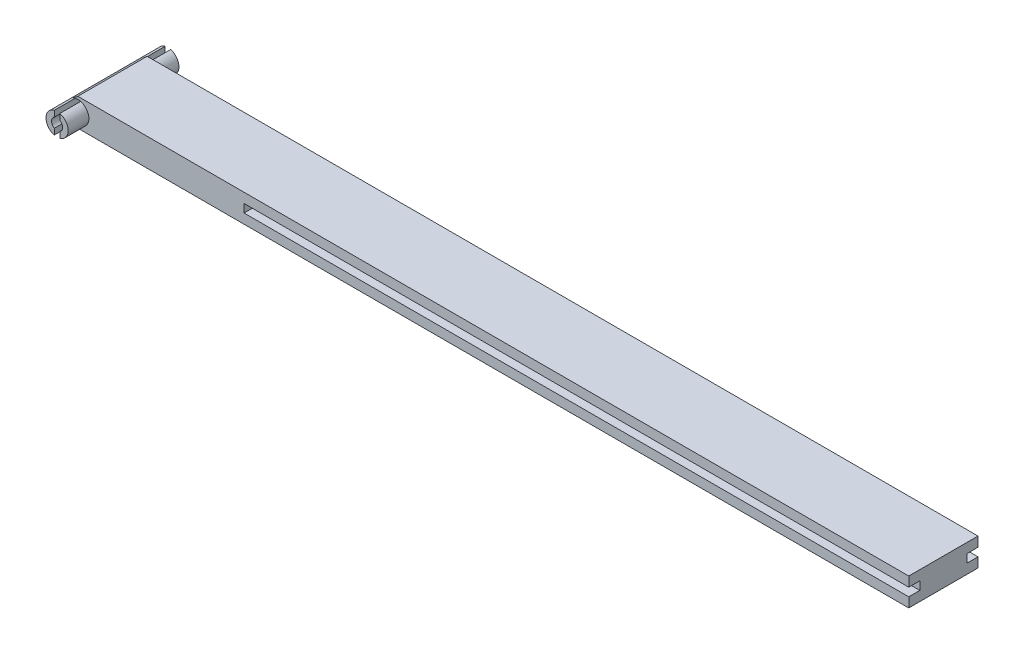
ISO-10303-21;
HEADER;
FILE_DESCRIPTION(('STEP AP214'),'2;1');
FILE_NAME('part.step','',(''),(''),'','','');
FILE_SCHEMA(('AUTOMOTIVE_DESIGN { 1 0 10303 214 1 1 1 1 }'));
ENDSEC;
DATA;
#1=APPLICATION_CONTEXT('core data for automotive mechanical design processes');
#2=APPLICATION_PROTOCOL_DEFINITION('international standard','automotive_design',2000,#1);
#3=PRODUCT_CONTEXT('',#1,'mechanical');
#4=PRODUCT('Part','Part','',(#3));
#5=PRODUCT_RELATED_PRODUCT_CATEGORY('part','',(#4));
#6=PRODUCT_DEFINITION_FORMATION('','',#4);
#7=PRODUCT_DEFINITION_CONTEXT('part definition',#1,'design');
#8=PRODUCT_DEFINITION('design','',#6,#7);
#9=PRODUCT_DEFINITION_SHAPE('','',#8);
#10=(LENGTH_UNIT() NAMED_UNIT(*) SI_UNIT(.MILLI.,.METRE.));
#11=(NAMED_UNIT(*) PLANE_ANGLE_UNIT() SI_UNIT($,.RADIAN.));
#12=(NAMED_UNIT(*) SI_UNIT($,.STERADIAN.) SOLID_ANGLE_UNIT());
#13=UNCERTAINTY_MEASURE_WITH_UNIT(LENGTH_MEASURE(1.E-05),#10,'distance_accuracy_value','');
#14=(GEOMETRIC_REPRESENTATION_CONTEXT(3) GLOBAL_UNCERTAINTY_ASSIGNED_CONTEXT((#13)) GLOBAL_UNIT_ASSIGNED_CONTEXT((#10,
#11,#12)) REPRESENTATION_CONTEXT('',''));
#15=CARTESIAN_POINT('',(0.,0.,0.));
#16=DIRECTION('',(0.,0.,1.));
#17=DIRECTION('',(1.,0.,0.));
#18=AXIS2_PLACEMENT_3D('',#15,#16,#17);
#19=CARTESIAN_POINT('',(-75.,5.,-6.25));
#20=DIRECTION('',(0.,0.,1.));
#21=DIRECTION('',(1.,0.,0.));
#22=AXIS2_PLACEMENT_3D('',#19,#20,#21);
#23=PLANE('',#22);
#24=DIRECTION('',(-1.,0.,0.));
#25=VECTOR('',#24,1.);
#26=CARTESIAN_POINT('',(75.,3.25,-6.25));
#27=LINE('',#26,#25);
#28=CARTESIAN_POINT('',(75.,3.25,-6.25));
#29=VERTEX_POINT('',#28);
#30=CARTESIAN_POINT('',(-45.,3.24999999999994,-6.25));
#31=VERTEX_POINT('',#30);
#32=EDGE_CURVE('E248',#29,#31,#27,.T.);
#33=ORIENTED_EDGE('',*,*,#32,.T.);
#34=DIRECTION('',(0.,-1.,0.));
#35=VECTOR('',#34,1.);
#36=CARTESIAN_POINT('',(-45.,3.24999999999994,-6.25));
#37=LINE('',#36,#35);
#38=CARTESIAN_POINT('',(-45.,1.74999999999999,-6.25));
#39=VERTEX_POINT('',#38);
#40=EDGE_CURVE('E541',#31,#39,#37,.T.);
#41=ORIENTED_EDGE('',*,*,#40,.T.);
#42=DIRECTION('',(1.,0.,0.));
#43=VECTOR('',#42,1.);
#44=CARTESIAN_POINT('',(75.,1.75,-6.25));
#45=LINE('',#44,#43);
#46=CARTESIAN_POINT('',(75.,1.75,-6.25));
#47=VERTEX_POINT('',#46);
#48=EDGE_CURVE('E543',#39,#47,#45,.T.);
#49=ORIENTED_EDGE('',*,*,#48,.T.);
#50=DIRECTION('',(0.,-1.,0.));
#51=VECTOR('',#50,1.);
#52=CARTESIAN_POINT('',(75.,5.,-6.25));
#53=LINE('',#52,#51);
#54=CARTESIAN_POINT('',(75.,0.,-6.25));
#55=VERTEX_POINT('',#54);
#56=EDGE_CURVE('E253',#47,#55,#53,.T.);
#57=ORIENTED_EDGE('',*,*,#56,.T.);
#58=DIRECTION('',(-1.,0.,0.));
#59=VECTOR('',#58,1.);
#60=CARTESIAN_POINT('',(-75.,0.,-6.25));
#61=LINE('',#60,#59);
#62=CARTESIAN_POINT('',(-75.,0.,-6.25));
#63=VERTEX_POINT('',#62);
#64=EDGE_CURVE('E381',#55,#63,#61,.T.);
#65=ORIENTED_EDGE('',*,*,#64,.T.);
#66=CARTESIAN_POINT('',(-81.5572478983184,-7.54999999999998,-6.25));
#67=DIRECTION('',(0.,0.,1.));
#68=DIRECTION('',(1.,0.,0.));
#69=AXIS2_PLACEMENT_3D('',#66,#67,#68);
#70=CIRCLE('',#69,10.);
#71=CARTESIAN_POINT('',(-76.0928746497197,0.825000000000004,-6.25));
#72=VERTEX_POINT('',#71);
#73=EDGE_CURVE('E415',#63,#72,#70,.T.);
#74=ORIENTED_EDGE('',*,*,#73,.T.);
#75=CARTESIAN_POINT('',(-75.,2.5,-6.25));
#76=DIRECTION('',(0.,0.,1.));
#77=DIRECTION('',(1.,0.,0.));
#78=AXIS2_PLACEMENT_3D('',#75,#76,#77);
#79=CIRCLE('',#78,2.);
#80=CARTESIAN_POINT('',(-75.5,0.563508326896296,-6.25));
#81=VERTEX_POINT('',#80);
#82=EDGE_CURVE('E405',#72,#81,#79,.T.);
#83=ORIENTED_EDGE('',*,*,#82,.T.);
#84=DIRECTION('',(0.,1.,0.));
#85=VECTOR('',#84,1.);
#86=CARTESIAN_POINT('',(-75.5,5.,-6.25));
#87=LINE('',#86,#85);
#88=CARTESIAN_POINT('',(-75.5,0.499999999999999,-6.25));
#89=VERTEX_POINT('',#88);
#90=EDGE_CURVE('E320',#89,#81,#87,.T.);
#91=ORIENTED_EDGE('',*,*,#90,.F.);
#92=DIRECTION('',(-1.,0.,0.));
#93=VECTOR('',#92,1.);
#94=CARTESIAN_POINT('',(-75.,0.499999999999999,-6.25));
#95=LINE('',#94,#93);
#96=CARTESIAN_POINT('',(-74.5,0.499999999999999,-6.25));
#97=VERTEX_POINT('',#96);
#98=EDGE_CURVE('E335',#97,#89,#95,.T.);
#99=ORIENTED_EDGE('',*,*,#98,.F.);
#100=DIRECTION('',(0.,-1.,0.));
#101=VECTOR('',#100,1.);
#102=CARTESIAN_POINT('',(-74.5,5.,-6.25));
#103=LINE('',#102,#101);
#104=CARTESIAN_POINT('',(-74.5,0.563508326896296,-6.25));
#105=VERTEX_POINT('',#104);
#106=EDGE_CURVE('E332',#105,#97,#103,.T.);
#107=ORIENTED_EDGE('',*,*,#106,.F.);
#108=CARTESIAN_POINT('',(-74.5,4.4364916731037,-6.25));
#109=VERTEX_POINT('',#108);
#110=EDGE_CURVE('E409',#105,#109,#79,.T.);
#111=ORIENTED_EDGE('',*,*,#110,.T.);
#112=CARTESIAN_POINT('',(-74.5,4.5,-6.25));
#113=VERTEX_POINT('',#112);
#114=EDGE_CURVE('E329',#113,#109,#103,.T.);
#115=ORIENTED_EDGE('',*,*,#114,.F.);
#116=DIRECTION('',(1.,0.,0.));
#117=VECTOR('',#116,1.);
#118=CARTESIAN_POINT('',(-75.,4.5,-6.25));
#119=LINE('',#118,#117);
#120=CARTESIAN_POINT('',(-75.5,4.5,-6.25));
#121=VERTEX_POINT('',#120);
#122=EDGE_CURVE('E337',#121,#113,#119,.T.);
#123=ORIENTED_EDGE('',*,*,#122,.F.);
#124=CARTESIAN_POINT('',(-75.5,4.4364916731037,-6.25));
#125=VERTEX_POINT('',#124);
#126=EDGE_CURVE('E323',#125,#121,#87,.T.);
#127=ORIENTED_EDGE('',*,*,#126,.F.);
#128=CARTESIAN_POINT('',(-76.0928746497197,4.175,-6.25));
#129=VERTEX_POINT('',#128);
#130=EDGE_CURVE('E404',#125,#129,#79,.T.);
#131=ORIENTED_EDGE('',*,*,#130,.T.);
#132=CARTESIAN_POINT('',(-81.5572478983184,12.55,-6.25));
#133=DIRECTION('',(0.,0.,1.));
#134=DIRECTION('',(1.,0.,0.));
#135=AXIS2_PLACEMENT_3D('',#132,#133,#134);
#136=CIRCLE('',#135,10.);
#137=CARTESIAN_POINT('',(-75.,5.,-6.25));
#138=VERTEX_POINT('',#137);
#139=EDGE_CURVE('E423',#129,#138,#136,.T.);
#140=ORIENTED_EDGE('',*,*,#139,.T.);
#141=DIRECTION('',(-1.,0.,0.));
#142=VECTOR('',#141,1.);
#143=CARTESIAN_POINT('',(-75.,5.,-6.25));
#144=LINE('',#143,#142);
#145=CARTESIAN_POINT('',(75.,5.,-6.25));
#146=VERTEX_POINT('',#145);
#147=EDGE_CURVE('E385',#146,#138,#144,.T.);
#148=ORIENTED_EDGE('',*,*,#147,.F.);
#149=EDGE_CURVE('E397',#146,#29,#53,.T.);
#150=ORIENTED_EDGE('',*,*,#149,.T.);
#151=EDGE_LOOP('',(#33,#41,#49,#57,#65,#74,#83,#91,#99,#107,#111,#115,#123,#127,#131,#140,#148,#150));
#152=FACE_BOUND('',#151,.T.);
#153=ADVANCED_FACE('F32',(#152),#23,.F.);
#154=CARTESIAN_POINT('',(75.,5.,-6.25));
#155=DIRECTION('',(-1.,0.,0.));
#156=DIRECTION('',(0.,0.,1.));
#157=AXIS2_PLACEMENT_3D('',#154,#155,#156);
#158=PLANE('',#157);
#159=DIRECTION('',(0.,0.,-1.));
#160=VECTOR('',#159,1.);
#161=CARTESIAN_POINT('',(75.,3.25,-4.25));
#162=LINE('',#161,#160);
#163=CARTESIAN_POINT('',(75.,3.25,-4.25));
#164=VERTEX_POINT('',#163);
#165=EDGE_CURVE('E47',#164,#29,#162,.T.);
#166=ORIENTED_EDGE('',*,*,#165,.T.);
#167=ORIENTED_EDGE('',*,*,#149,.F.);
#168=DIRECTION('',(0.,0.,-1.));
#169=VECTOR('',#168,1.);
#170=CARTESIAN_POINT('',(75.,5.,-6.25));
#171=LINE('',#170,#169);
#172=CARTESIAN_POINT('',(75.,5.,6.25));
#173=VERTEX_POINT('',#172);
#174=EDGE_CURVE('E383',#173,#146,#171,.T.);
#175=ORIENTED_EDGE('',*,*,#174,.F.);
#176=DIRECTION('',(0.,-1.,0.));
#177=VECTOR('',#176,1.);
#178=CARTESIAN_POINT('',(75.,5.,6.25));
#179=LINE('',#178,#177);
#180=CARTESIAN_POINT('',(75.,3.25,6.25));
#181=VERTEX_POINT('',#180);
#182=EDGE_CURVE('E401',#173,#181,#179,.T.);
#183=ORIENTED_EDGE('',*,*,#182,.T.);
#184=DIRECTION('',(0.,0.,1.));
#185=VECTOR('',#184,1.);
#186=CARTESIAN_POINT('',(75.,3.25,4.25));
#187=LINE('',#186,#185);
#188=CARTESIAN_POINT('',(75.,3.25,4.25));
#189=VERTEX_POINT('',#188);
#190=EDGE_CURVE('E269',#189,#181,#187,.T.);
#191=ORIENTED_EDGE('',*,*,#190,.F.);
#192=DIRECTION('',(0.,1.,0.));
#193=VECTOR('',#192,1.);
#194=CARTESIAN_POINT('',(75.,3.25,4.25));
#195=LINE('',#194,#193);
#196=CARTESIAN_POINT('',(75.,1.74999999999999,4.25));
#197=VERTEX_POINT('',#196);
#198=EDGE_CURVE('E260',#197,#189,#195,.T.);
#199=ORIENTED_EDGE('',*,*,#198,.F.);
#200=DIRECTION('',(0.,0.,1.));
#201=VECTOR('',#200,1.);
#202=CARTESIAN_POINT('',(75.,1.75,4.25));
#203=LINE('',#202,#201);
#204=CARTESIAN_POINT('',(75.,1.75,6.25));
#205=VERTEX_POINT('',#204);
#206=EDGE_CURVE('E277',#197,#205,#203,.T.);
#207=ORIENTED_EDGE('',*,*,#206,.T.);
#208=CARTESIAN_POINT('',(75.,0.,6.25));
#209=VERTEX_POINT('',#208);
#210=EDGE_CURVE('E400',#205,#209,#179,.T.);
#211=ORIENTED_EDGE('',*,*,#210,.T.);
#212=DIRECTION('',(0.,0.,-1.));
#213=VECTOR('',#212,1.);
#214=CARTESIAN_POINT('',(75.,0.,-6.25));
#215=LINE('',#214,#213);
#216=EDGE_CURVE('E393',#209,#55,#215,.T.);
#217=ORIENTED_EDGE('',*,*,#216,.T.);
#218=ORIENTED_EDGE('',*,*,#56,.F.);
#219=DIRECTION('',(0.,0.,-1.));
#220=VECTOR('',#219,1.);
#221=CARTESIAN_POINT('',(75.,1.75,-4.25));
#222=LINE('',#221,#220);
#223=CARTESIAN_POINT('',(75.,1.75,-4.25));
#224=VERTEX_POINT('',#223);
#225=EDGE_CURVE('E236',#224,#47,#222,.T.);
#226=ORIENTED_EDGE('',*,*,#225,.F.);
#227=DIRECTION('',(0.,1.,0.));
#228=VECTOR('',#227,1.);
#229=CARTESIAN_POINT('',(75.,3.25,-4.25));
#230=LINE('',#229,#228);
#231=EDGE_CURVE('E242',#224,#164,#230,.T.);
#232=ORIENTED_EDGE('',*,*,#231,.T.);
#233=EDGE_LOOP('',(#166,#167,#175,#183,#191,#199,#207,#211,#217,#218,#226,#232));
#234=FACE_BOUND('',#233,.T.);
#235=ADVANCED_FACE('F251',(#234),#158,.F.);
#236=CARTESIAN_POINT('',(-75.,5.,6.25));
#237=DIRECTION('',(0.,0.,-1.));
#238=DIRECTION('',(-1.,0.,0.));
#239=AXIS2_PLACEMENT_3D('',#236,#237,#238);
#240=PLANE('',#239);
#241=ORIENTED_EDGE('',*,*,#210,.F.);
#242=DIRECTION('',(1.,0.,0.));
#243=VECTOR('',#242,1.);
#244=CARTESIAN_POINT('',(75.,1.75,6.25));
#245=LINE('',#244,#243);
#246=CARTESIAN_POINT('',(-45.,1.74999999999999,6.25));
#247=VERTEX_POINT('',#246);
#248=EDGE_CURVE('E263',#247,#205,#245,.T.);
#249=ORIENTED_EDGE('',*,*,#248,.F.);
#250=DIRECTION('',(0.,-1.,0.));
#251=VECTOR('',#250,1.);
#252=CARTESIAN_POINT('',(-45.,3.24999999999994,6.25));
#253=LINE('',#252,#251);
#254=CARTESIAN_POINT('',(-45.,3.24999999999994,6.25));
#255=VERTEX_POINT('',#254);
#256=EDGE_CURVE('E273',#255,#247,#253,.T.);
#257=ORIENTED_EDGE('',*,*,#256,.F.);
#258=DIRECTION('',(-1.,0.,0.));
#259=VECTOR('',#258,1.);
#260=CARTESIAN_POINT('',(75.,3.25,6.25));
#261=LINE('',#260,#259);
#262=EDGE_CURVE('E270',#181,#255,#261,.T.);
#263=ORIENTED_EDGE('',*,*,#262,.F.);
#264=ORIENTED_EDGE('',*,*,#182,.F.);
#265=DIRECTION('',(1.,0.,0.));
#266=VECTOR('',#265,1.);
#267=CARTESIAN_POINT('',(-75.,5.,6.25));
#268=LINE('',#267,#266);
#269=CARTESIAN_POINT('',(-75.,5.,6.25));
#270=VERTEX_POINT('',#269);
#271=EDGE_CURVE('E380',#270,#173,#268,.T.);
#272=ORIENTED_EDGE('',*,*,#271,.F.);
#273=CARTESIAN_POINT('',(-81.5572478983184,12.55,6.25));
#274=DIRECTION('',(0.,0.,-1.));
#275=DIRECTION('',(-1.,0.,0.));
#276=AXIS2_PLACEMENT_3D('',#273,#274,#275);
#277=CIRCLE('',#276,10.);
#278=CARTESIAN_POINT('',(-76.0928746497197,4.175,6.25));
#279=VERTEX_POINT('',#278);
#280=EDGE_CURVE('E420',#270,#279,#277,.T.);
#281=ORIENTED_EDGE('',*,*,#280,.T.);
#282=CARTESIAN_POINT('',(-75.,2.5,6.25));
#283=DIRECTION('',(0.,0.,-1.));
#284=DIRECTION('',(-1.,0.,0.));
#285=AXIS2_PLACEMENT_3D('',#282,#283,#284);
#286=CIRCLE('',#285,2.);
#287=CARTESIAN_POINT('',(-75.5,4.4364916731037,6.25));
#288=VERTEX_POINT('',#287);
#289=EDGE_CURVE('E371',#279,#288,#286,.T.);
#290=ORIENTED_EDGE('',*,*,#289,.T.);
#291=DIRECTION('',(0.,1.,0.));
#292=VECTOR('',#291,1.);
#293=CARTESIAN_POINT('',(-75.5,4.5,6.25));
#294=LINE('',#293,#292);
#295=CARTESIAN_POINT('',(-75.5,4.5,6.25));
#296=VERTEX_POINT('',#295);
#297=EDGE_CURVE('E292',#288,#296,#294,.T.);
#298=ORIENTED_EDGE('',*,*,#297,.T.);
#299=DIRECTION('',(1.,0.,0.));
#300=VECTOR('',#299,1.);
#301=CARTESIAN_POINT('',(-75.5,4.5,6.25));
#302=LINE('',#301,#300);
#303=CARTESIAN_POINT('',(-74.5,4.5,6.25));
#304=VERTEX_POINT('',#303);
#305=EDGE_CURVE('E306',#296,#304,#302,.T.);
#306=ORIENTED_EDGE('',*,*,#305,.T.);
#307=DIRECTION('',(0.,-1.,0.));
#308=VECTOR('',#307,1.);
#309=CARTESIAN_POINT('',(-74.5,4.5,6.25));
#310=LINE('',#309,#308);
#311=CARTESIAN_POINT('',(-74.5,4.4364916731037,6.25));
#312=VERTEX_POINT('',#311);
#313=EDGE_CURVE('E286',#304,#312,#310,.T.);
#314=ORIENTED_EDGE('',*,*,#313,.T.);
#315=CARTESIAN_POINT('',(-74.5,0.563508326896295,6.25));
#316=VERTEX_POINT('',#315);
#317=EDGE_CURVE('E375',#312,#316,#286,.T.);
#318=ORIENTED_EDGE('',*,*,#317,.T.);
#319=CARTESIAN_POINT('',(-74.5,0.499999999999999,6.25));
#320=VERTEX_POINT('',#319);
#321=EDGE_CURVE('E289',#316,#320,#310,.T.);
#322=ORIENTED_EDGE('',*,*,#321,.T.);
#323=DIRECTION('',(-1.,0.,0.));
#324=VECTOR('',#323,1.);
#325=CARTESIAN_POINT('',(-75.5,0.499999999999999,6.25));
#326=LINE('',#325,#324);
#327=CARTESIAN_POINT('',(-75.5,0.499999999999999,6.25));
#328=VERTEX_POINT('',#327);
#329=EDGE_CURVE('E288',#320,#328,#326,.T.);
#330=ORIENTED_EDGE('',*,*,#329,.T.);
#331=CARTESIAN_POINT('',(-75.5,0.563508326896295,6.25));
#332=VERTEX_POINT('',#331);
#333=EDGE_CURVE('E293',#328,#332,#294,.T.);
#334=ORIENTED_EDGE('',*,*,#333,.T.);
#335=CARTESIAN_POINT('',(-76.0928746497197,0.825000000000003,6.25));
#336=VERTEX_POINT('',#335);
#337=EDGE_CURVE('E376',#332,#336,#286,.T.);
#338=ORIENTED_EDGE('',*,*,#337,.T.);
#339=CARTESIAN_POINT('',(-81.5572478983184,-7.54999999999998,6.25));
#340=DIRECTION('',(0.,0.,-1.));
#341=DIRECTION('',(-1.,0.,0.));
#342=AXIS2_PLACEMENT_3D('',#339,#340,#341);
#343=CIRCLE('',#342,10.);
#344=CARTESIAN_POINT('',(-75.,0.,6.25));
#345=VERTEX_POINT('',#344);
#346=EDGE_CURVE('E418',#336,#345,#343,.T.);
#347=ORIENTED_EDGE('',*,*,#346,.T.);
#348=DIRECTION('',(1.,0.,0.));
#349=VECTOR('',#348,1.);
#350=CARTESIAN_POINT('',(-75.,0.,6.25));
#351=LINE('',#350,#349);
#352=EDGE_CURVE('E390',#345,#209,#351,.T.);
#353=ORIENTED_EDGE('',*,*,#352,.T.);
#354=EDGE_LOOP('',(#241,#249,#257,#263,#264,#272,#281,#290,#298,#306,#314,#318,#322,#330,#334,
#338,#347,#353));
#355=FACE_BOUND('',#354,.T.);
#356=ADVANCED_FACE('F491',(#355),#240,.F.);
#357=CARTESIAN_POINT('',(-75.,2.5,-10.));
#358=DIRECTION('',(0.,0.,1.));
#359=DIRECTION('',(1.,0.,0.));
#360=AXIS2_PLACEMENT_3D('',#357,#358,#359);
#361=CYLINDRICAL_SURFACE('',#360,2.);
#362=ORIENTED_EDGE('',*,*,#110,.F.);
#363=DIRECTION('',(0.,0.,1.));
#364=VECTOR('',#363,1.);
#365=CARTESIAN_POINT('',(-74.5,0.563508326896296,-10.));
#366=LINE('',#365,#364);
#367=CARTESIAN_POINT('',(-74.5,0.563508326896295,-10.));
#368=VERTEX_POINT('',#367);
#369=EDGE_CURVE('E331',#105,#368,#366,.F.);
#370=ORIENTED_EDGE('',*,*,#369,.T.);
#371=CARTESIAN_POINT('',(-75.,2.5,-10.));
#372=DIRECTION('',(0.,0.,1.));
#373=DIRECTION('',(1.,0.,0.));
#374=AXIS2_PLACEMENT_3D('',#371,#372,#373);
#375=CIRCLE('',#374,2.);
#376=CARTESIAN_POINT('',(-74.5,4.4364916731037,-10.));
#377=VERTEX_POINT('',#376);
#378=EDGE_CURVE('E367',#368,#377,#375,.T.);
#379=ORIENTED_EDGE('',*,*,#378,.T.);
#380=DIRECTION('',(0.,0.,1.));
#381=VECTOR('',#380,1.);
#382=CARTESIAN_POINT('',(-74.5,4.4364916731037,-10.));
#383=LINE('',#382,#381);
#384=EDGE_CURVE('E326',#377,#109,#383,.T.);
#385=ORIENTED_EDGE('',*,*,#384,.T.);
#386=EDGE_LOOP('',(#362,#370,#379,#385));
#387=FACE_BOUND('',#386,.T.);
#388=ADVANCED_FACE('F461',(#387),#361,.T.);
#389=ORIENTED_EDGE('',*,*,#130,.F.);
#390=DIRECTION('',(0.,0.,1.));
#391=VECTOR('',#390,1.);
#392=CARTESIAN_POINT('',(-75.5,4.4364916731037,-10.));
#393=LINE('',#392,#391);
#394=CARTESIAN_POINT('',(-75.5,4.4364916731037,-10.));
#395=VERTEX_POINT('',#394);
#396=EDGE_CURVE('E322',#125,#395,#393,.F.);
#397=ORIENTED_EDGE('',*,*,#396,.T.);
#398=CARTESIAN_POINT('',(-75.5,0.563508326896295,-10.));
#399=VERTEX_POINT('',#398);
#400=EDGE_CURVE('E370',#395,#399,#375,.T.);
#401=ORIENTED_EDGE('',*,*,#400,.T.);
#402=DIRECTION('',(0.,0.,1.));
#403=VECTOR('',#402,1.);
#404=CARTESIAN_POINT('',(-75.5,0.563508326896296,-10.));
#405=LINE('',#404,#403);
#406=EDGE_CURVE('E295',#399,#81,#405,.T.);
#407=ORIENTED_EDGE('',*,*,#406,.T.);
#408=ORIENTED_EDGE('',*,*,#82,.F.);
#409=DIRECTION('',(0.,0.,1.));
#410=VECTOR('',#409,1.);
#411=CARTESIAN_POINT('',(-76.0928746497197,0.825000000000004,-10.));
#412=LINE('',#411,#410);
#413=EDGE_CURVE('E412',#72,#336,#412,.T.);
#414=ORIENTED_EDGE('',*,*,#413,.T.);
#415=ORIENTED_EDGE('',*,*,#337,.F.);
#416=DIRECTION('',(0.,0.,1.));
#417=VECTOR('',#416,1.);
#418=CARTESIAN_POINT('',(-75.5,0.563508326896296,-10.));
#419=LINE('',#418,#417);
#420=CARTESIAN_POINT('',(-75.5,0.563508326896295,10.));
#421=VERTEX_POINT('',#420);
#422=EDGE_CURVE('E347',#421,#332,#419,.F.);
#423=ORIENTED_EDGE('',*,*,#422,.F.);
#424=CARTESIAN_POINT('',(-75.,2.5,10.));
#425=DIRECTION('',(0.,0.,1.));
#426=DIRECTION('',(1.,0.,0.));
#427=AXIS2_PLACEMENT_3D('',#424,#425,#426);
#428=CIRCLE('',#427,2.);
#429=CARTESIAN_POINT('',(-75.5,4.4364916731037,10.));
#430=VERTEX_POINT('',#429);
#431=EDGE_CURVE('E366',#430,#421,#428,.T.);
#432=ORIENTED_EDGE('',*,*,#431,.F.);
#433=DIRECTION('',(0.,0.,1.));
#434=VECTOR('',#433,1.);
#435=CARTESIAN_POINT('',(-75.5,4.4364916731037,-10.));
#436=LINE('',#435,#434);
#437=EDGE_CURVE('E345',#288,#430,#436,.T.);
#438=ORIENTED_EDGE('',*,*,#437,.F.);
#439=ORIENTED_EDGE('',*,*,#289,.F.);
#440=DIRECTION('',(0.,0.,1.));
#441=VECTOR('',#440,1.);
#442=CARTESIAN_POINT('',(-76.0928746497197,4.175,-10.));
#443=LINE('',#442,#441);
#444=EDGE_CURVE('E408',#279,#129,#443,.F.);
#445=ORIENTED_EDGE('',*,*,#444,.T.);
#446=EDGE_LOOP('',(#389,#397,#401,#407,#408,#414,#415,#423,#432,#438,#439,#445));
#447=FACE_BOUND('',#446,.T.);
#448=ADVANCED_FACE('F449',(#447),#361,.T.);
#449=CARTESIAN_POINT('',(-75.,2.5,-10.));
#450=DIRECTION('',(0.,0.,1.));
#451=DIRECTION('',(1.,0.,0.));
#452=AXIS2_PLACEMENT_3D('',#449,#450,#451);
#453=PLANE('',#452);
#454=DIRECTION('',(0.,1.,0.));
#455=VECTOR('',#454,1.);
#456=CARTESIAN_POINT('',(-74.5,4.5,-10.));
#457=LINE('',#456,#455);
#458=CARTESIAN_POINT('',(-74.5,3.36602540378444,-10.));
#459=VERTEX_POINT('',#458);
#460=EDGE_CURVE('E299',#459,#377,#457,.T.);
#461=ORIENTED_EDGE('',*,*,#460,.T.);
#462=ORIENTED_EDGE('',*,*,#378,.F.);
#463=CARTESIAN_POINT('',(-74.5,1.63397459621556,-10.));
#464=VERTEX_POINT('',#463);
#465=EDGE_CURVE('E302',#368,#464,#457,.T.);
#466=ORIENTED_EDGE('',*,*,#465,.T.);
#467=CARTESIAN_POINT('',(-75.,2.5,-10.));
#468=DIRECTION('',(0.,0.,1.));
#469=DIRECTION('',(1.,0.,0.));
#470=AXIS2_PLACEMENT_3D('',#467,#468,#469);
#471=CIRCLE('',#470,0.999999999999998);
#472=EDGE_CURVE('E356',#464,#459,#471,.T.);
#473=ORIENTED_EDGE('',*,*,#472,.T.);
#474=EDGE_LOOP('',(#461,#462,#466,#473));
#475=FACE_BOUND('',#474,.T.);
#476=ADVANCED_FACE('F467',(#475),#453,.F.);
#477=DIRECTION('',(0.,-1.,0.));
#478=VECTOR('',#477,1.);
#479=CARTESIAN_POINT('',(-75.5,4.5,-10.));
#480=LINE('',#479,#478);
#481=CARTESIAN_POINT('',(-75.5,1.63397459621556,-10.));
#482=VERTEX_POINT('',#481);
#483=EDGE_CURVE('E280',#482,#399,#480,.T.);
#484=ORIENTED_EDGE('',*,*,#483,.T.);
#485=ORIENTED_EDGE('',*,*,#400,.F.);
#486=CARTESIAN_POINT('',(-75.5,3.36602540378444,-10.));
#487=VERTEX_POINT('',#486);
#488=EDGE_CURVE('E298',#395,#487,#480,.T.);
#489=ORIENTED_EDGE('',*,*,#488,.T.);
#490=EDGE_CURVE('E359',#487,#482,#471,.T.);
#491=ORIENTED_EDGE('',*,*,#490,.T.);
#492=EDGE_LOOP('',(#484,#485,#489,#491));
#493=FACE_BOUND('',#492,.T.);
#494=ADVANCED_FACE('F443',(#493),#453,.F.);
#495=CARTESIAN_POINT('',(-75.,2.5,-10.));
#496=DIRECTION('',(0.,0.,1.));
#497=DIRECTION('',(1.,0.,0.));
#498=AXIS2_PLACEMENT_3D('',#495,#496,#497);
#499=CYLINDRICAL_SURFACE('',#498,0.999999999999998);
#500=ORIENTED_EDGE('',*,*,#472,.F.);
#501=DIRECTION('',(0.,0.,1.));
#502=VECTOR('',#501,1.);
#503=CARTESIAN_POINT('',(-74.5,1.63397459621556,-10.));
#504=LINE('',#503,#502);
#505=CARTESIAN_POINT('',(-74.5,1.63397459621556,10.));
#506=VERTEX_POINT('',#505);
#507=EDGE_CURVE('E11',#464,#506,#504,.T.);
#508=ORIENTED_EDGE('',*,*,#507,.T.);
#509=CARTESIAN_POINT('',(-75.,2.5,10.));
#510=DIRECTION('',(0.,0.,1.));
#511=DIRECTION('',(1.,0.,0.));
#512=AXIS2_PLACEMENT_3D('',#509,#510,#511);
#513=CIRCLE('',#512,0.999999999999998);
#514=CARTESIAN_POINT('',(-74.5,3.36602540378444,10.));
#515=VERTEX_POINT('',#514);
#516=EDGE_CURVE('E355',#506,#515,#513,.T.);
#517=ORIENTED_EDGE('',*,*,#516,.T.);
#518=DIRECTION('',(0.,0.,1.));
#519=VECTOR('',#518,1.);
#520=CARTESIAN_POINT('',(-74.5,3.36602540378444,-10.));
#521=LINE('',#520,#519);
#522=EDGE_CURVE('E428',#515,#459,#521,.F.);
#523=ORIENTED_EDGE('',*,*,#522,.T.);
#524=EDGE_LOOP('',(#500,#508,#517,#523));
#525=FACE_BOUND('',#524,.T.);
#526=ADVANCED_FACE('F471',(#525),#499,.F.);
#527=ORIENTED_EDGE('',*,*,#490,.F.);
#528=DIRECTION('',(0.,0.,1.));
#529=VECTOR('',#528,1.);
#530=CARTESIAN_POINT('',(-75.5,3.36602540378444,-10.));
#531=LINE('',#530,#529);
#532=CARTESIAN_POINT('',(-75.5,3.36602540378444,10.));
#533=VERTEX_POINT('',#532);
#534=EDGE_CURVE('E425',#487,#533,#531,.T.);
#535=ORIENTED_EDGE('',*,*,#534,.T.);
#536=CARTESIAN_POINT('',(-75.5,1.63397459621556,10.));
#537=VERTEX_POINT('',#536);
#538=EDGE_CURVE('E360',#533,#537,#513,.T.);
#539=ORIENTED_EDGE('',*,*,#538,.T.);
#540=DIRECTION('',(0.,0.,1.));
#541=VECTOR('',#540,1.);
#542=CARTESIAN_POINT('',(-75.5,1.63397459621556,-10.));
#543=LINE('',#542,#541);
#544=EDGE_CURVE('E40',#537,#482,#543,.F.);
#545=ORIENTED_EDGE('',*,*,#544,.T.);
#546=EDGE_LOOP('',(#527,#535,#539,#545));
#547=FACE_BOUND('',#546,.T.);
#548=ADVANCED_FACE('F433',(#547),#499,.F.);
#549=DIRECTION('',(0.,0.,1.));
#550=VECTOR('',#549,1.);
#551=CARTESIAN_POINT('',(-74.5,4.4364916731037,-10.));
#552=LINE('',#551,#550);
#553=CARTESIAN_POINT('',(-74.5,4.4364916731037,10.));
#554=VERTEX_POINT('',#553);
#555=EDGE_CURVE('E352',#554,#312,#552,.F.);
#556=ORIENTED_EDGE('',*,*,#555,.F.);
#557=CARTESIAN_POINT('',(-74.5,0.563508326896295,10.));
#558=VERTEX_POINT('',#557);
#559=EDGE_CURVE('E363',#558,#554,#428,.T.);
#560=ORIENTED_EDGE('',*,*,#559,.F.);
#561=DIRECTION('',(0.,0.,1.));
#562=VECTOR('',#561,1.);
#563=CARTESIAN_POINT('',(-74.5,0.563508326896296,-10.));
#564=LINE('',#563,#562);
#565=EDGE_CURVE('E350',#316,#558,#564,.T.);
#566=ORIENTED_EDGE('',*,*,#565,.F.);
#567=ORIENTED_EDGE('',*,*,#317,.F.);
#568=EDGE_LOOP('',(#556,#560,#566,#567));
#569=FACE_BOUND('',#568,.T.);
#570=ADVANCED_FACE('F481',(#569),#361,.T.);
#571=CARTESIAN_POINT('',(-75.,2.5,10.));
#572=DIRECTION('',(0.,0.,1.));
#573=DIRECTION('',(1.,0.,0.));
#574=AXIS2_PLACEMENT_3D('',#571,#572,#573);
#575=PLANE('',#574);
#576=DIRECTION('',(0.,1.,0.));
#577=VECTOR('',#576,1.);
#578=CARTESIAN_POINT('',(-74.5,4.5,10.));
#579=LINE('',#578,#577);
#580=EDGE_CURVE('E342',#558,#506,#579,.T.);
#581=ORIENTED_EDGE('',*,*,#580,.F.);
#582=ORIENTED_EDGE('',*,*,#559,.T.);
#583=EDGE_CURVE('E340',#515,#554,#579,.T.);
#584=ORIENTED_EDGE('',*,*,#583,.F.);
#585=ORIENTED_EDGE('',*,*,#516,.F.);
#586=EDGE_LOOP('',(#581,#582,#584,#585));
#587=FACE_BOUND('',#586,.T.);
#588=ADVANCED_FACE('F477',(#587),#575,.T.);
#589=CARTESIAN_POINT('',(0.,5.,0.));
#590=DIRECTION('',(0.,1.,0.));
#591=DIRECTION('',(0.,0.,1.));
#592=AXIS2_PLACEMENT_3D('',#589,#590,#591);
#593=PLANE('',#592);
#594=DIRECTION('',(0.,0.,1.));
#595=VECTOR('',#594,1.);
#596=CARTESIAN_POINT('',(-75.,5.,-6.25));
#597=LINE('',#596,#595);
#598=EDGE_CURVE('E377',#138,#270,#597,.T.);
#599=ORIENTED_EDGE('',*,*,#598,.T.);
#600=ORIENTED_EDGE('',*,*,#271,.T.);
#601=ORIENTED_EDGE('',*,*,#174,.T.);
#602=ORIENTED_EDGE('',*,*,#147,.T.);
#603=EDGE_LOOP('',(#599,#600,#601,#602));
#604=FACE_BOUND('',#603,.T.);
#605=ADVANCED_FACE('F536',(#604),#593,.T.);
#606=CARTESIAN_POINT('',(0.,0.,0.));
#607=DIRECTION('',(0.,1.,0.));
#608=DIRECTION('',(0.,0.,1.));
#609=AXIS2_PLACEMENT_3D('',#606,#607,#608);
#610=PLANE('',#609);
#611=DIRECTION('',(0.,0.,1.));
#612=VECTOR('',#611,1.);
#613=CARTESIAN_POINT('',(-75.,0.,-6.25));
#614=LINE('',#613,#612);
#615=EDGE_CURVE('E374',#63,#345,#614,.T.);
#616=ORIENTED_EDGE('',*,*,#615,.F.);
#617=ORIENTED_EDGE('',*,*,#64,.F.);
#618=ORIENTED_EDGE('',*,*,#216,.F.);
#619=ORIENTED_EDGE('',*,*,#352,.F.);
#620=EDGE_LOOP('',(#616,#617,#618,#619));
#621=FACE_BOUND('',#620,.T.);
#622=ADVANCED_FACE('F517',(#621),#610,.F.);
#623=DIRECTION('',(0.,-1.,0.));
#624=VECTOR('',#623,1.);
#625=CARTESIAN_POINT('',(-75.5,4.5,10.));
#626=LINE('',#625,#624);
#627=EDGE_CURVE('E343',#430,#533,#626,.T.);
#628=ORIENTED_EDGE('',*,*,#627,.F.);
#629=ORIENTED_EDGE('',*,*,#431,.T.);
#630=EDGE_CURVE('E339',#537,#421,#626,.T.);
#631=ORIENTED_EDGE('',*,*,#630,.F.);
#632=ORIENTED_EDGE('',*,*,#538,.F.);
#633=EDGE_LOOP('',(#628,#629,#631,#632));
#634=FACE_BOUND('',#633,.T.);
#635=ADVANCED_FACE('F499',(#634),#575,.T.);
#636=CARTESIAN_POINT('',(-81.5572478983184,-7.54999999999998,-10.));
#637=DIRECTION('',(0.,0.,1.));
#638=DIRECTION('',(1.,0.,0.));
#639=AXIS2_PLACEMENT_3D('',#636,#637,#638);
#640=CYLINDRICAL_SURFACE('',#639,10.);
#641=ORIENTED_EDGE('',*,*,#346,.F.);
#642=ORIENTED_EDGE('',*,*,#413,.F.);
#643=ORIENTED_EDGE('',*,*,#73,.F.);
#644=ORIENTED_EDGE('',*,*,#615,.T.);
#645=EDGE_LOOP('',(#641,#642,#643,#644));
#646=FACE_BOUND('',#645,.T.);
#647=ADVANCED_FACE('F513',(#646),#640,.F.);
#648=CARTESIAN_POINT('',(-81.5572478983184,12.55,-10.));
#649=DIRECTION('',(0.,0.,-1.));
#650=DIRECTION('',(-1.,0.,0.));
#651=AXIS2_PLACEMENT_3D('',#648,#649,#650);
#652=CYLINDRICAL_SURFACE('',#651,10.);
#653=ORIENTED_EDGE('',*,*,#139,.F.);
#654=ORIENTED_EDGE('',*,*,#444,.F.);
#655=ORIENTED_EDGE('',*,*,#280,.F.);
#656=ORIENTED_EDGE('',*,*,#598,.F.);
#657=EDGE_LOOP('',(#653,#654,#655,#656));
#658=FACE_BOUND('',#657,.T.);
#659=ADVANCED_FACE('F34',(#658),#652,.F.);
#660=CARTESIAN_POINT('',(-75.5,4.5,2.12689437438234));
#661=DIRECTION('',(-1.,0.,0.));
#662=DIRECTION('',(0.,0.,1.));
#663=AXIS2_PLACEMENT_3D('',#660,#661,#662);
#664=PLANE('',#663);
#665=ORIENTED_EDGE('',*,*,#437,.T.);
#666=ORIENTED_EDGE('',*,*,#627,.T.);
#667=ORIENTED_EDGE('',*,*,#534,.F.);
#668=ORIENTED_EDGE('',*,*,#488,.F.);
#669=ORIENTED_EDGE('',*,*,#396,.F.);
#670=ORIENTED_EDGE('',*,*,#126,.T.);
#671=DIRECTION('',(0.,0.,-1.));
#672=VECTOR('',#671,1.);
#673=CARTESIAN_POINT('',(-75.5,4.5,10.3731056256177));
#674=LINE('',#673,#672);
#675=EDGE_CURVE('E313',#296,#121,#674,.T.);
#676=ORIENTED_EDGE('',*,*,#675,.F.);
#677=ORIENTED_EDGE('',*,*,#297,.F.);
#678=EDGE_LOOP('',(#665,#666,#667,#668,#669,#670,#676,#677));
#679=FACE_BOUND('',#678,.T.);
#680=ADVANCED_FACE('F445',(#679),#664,.F.);
#681=CARTESIAN_POINT('',(-74.5,4.5,2.12689437438234));
#682=DIRECTION('',(1.,0.,0.));
#683=DIRECTION('',(0.,0.,-1.));
#684=AXIS2_PLACEMENT_3D('',#681,#682,#683);
#685=PLANE('',#684);
#686=ORIENTED_EDGE('',*,*,#555,.T.);
#687=ORIENTED_EDGE('',*,*,#313,.F.);
#688=DIRECTION('',(0.,0.,-1.));
#689=VECTOR('',#688,1.);
#690=CARTESIAN_POINT('',(-74.5,4.5,10.3731056256177));
#691=LINE('',#690,#689);
#692=EDGE_CURVE('E310',#304,#113,#691,.T.);
#693=ORIENTED_EDGE('',*,*,#692,.T.);
#694=ORIENTED_EDGE('',*,*,#114,.T.);
#695=ORIENTED_EDGE('',*,*,#384,.F.);
#696=ORIENTED_EDGE('',*,*,#460,.F.);
#697=ORIENTED_EDGE('',*,*,#522,.F.);
#698=ORIENTED_EDGE('',*,*,#583,.T.);
#699=EDGE_LOOP('',(#686,#687,#693,#694,#695,#696,#697,#698));
#700=FACE_BOUND('',#699,.T.);
#701=ADVANCED_FACE('F465',(#700),#685,.F.);
#702=ORIENTED_EDGE('',*,*,#565,.T.);
#703=ORIENTED_EDGE('',*,*,#580,.T.);
#704=ORIENTED_EDGE('',*,*,#507,.F.);
#705=ORIENTED_EDGE('',*,*,#465,.F.);
#706=ORIENTED_EDGE('',*,*,#369,.F.);
#707=ORIENTED_EDGE('',*,*,#106,.T.);
#708=DIRECTION('',(0.,0.,-1.));
#709=VECTOR('',#708,1.);
#710=CARTESIAN_POINT('',(-74.5,0.499999999999999,10.3731056256177));
#711=LINE('',#710,#709);
#712=EDGE_CURVE('E307',#320,#97,#711,.T.);
#713=ORIENTED_EDGE('',*,*,#712,.F.);
#714=ORIENTED_EDGE('',*,*,#321,.F.);
#715=EDGE_LOOP('',(#702,#703,#704,#705,#706,#707,#713,#714));
#716=FACE_BOUND('',#715,.T.);
#717=ADVANCED_FACE('F506',(#716),#685,.F.);
#718=ORIENTED_EDGE('',*,*,#422,.T.);
#719=ORIENTED_EDGE('',*,*,#333,.F.);
#720=DIRECTION('',(0.,0.,-1.));
#721=VECTOR('',#720,1.);
#722=CARTESIAN_POINT('',(-75.5,0.499999999999999,10.3731056256177));
#723=LINE('',#722,#721);
#724=EDGE_CURVE('E303',#328,#89,#723,.T.);
#725=ORIENTED_EDGE('',*,*,#724,.T.);
#726=ORIENTED_EDGE('',*,*,#90,.T.);
#727=ORIENTED_EDGE('',*,*,#406,.F.);
#728=ORIENTED_EDGE('',*,*,#483,.F.);
#729=ORIENTED_EDGE('',*,*,#544,.F.);
#730=ORIENTED_EDGE('',*,*,#630,.T.);
#731=EDGE_LOOP('',(#718,#719,#725,#726,#727,#728,#729,#730));
#732=FACE_BOUND('',#731,.T.);
#733=ADVANCED_FACE('F438',(#732),#664,.F.);
#734=CARTESIAN_POINT('',(-75.5,0.499999999999999,10.3731056256177));
#735=DIRECTION('',(0.,1.,0.));
#736=DIRECTION('',(-1.,0.,0.));
#737=AXIS2_PLACEMENT_3D('',#734,#735,#736);
#738=PLANE('',#737);
#739=ORIENTED_EDGE('',*,*,#98,.T.);
#740=ORIENTED_EDGE('',*,*,#724,.F.);
#741=ORIENTED_EDGE('',*,*,#329,.F.);
#742=ORIENTED_EDGE('',*,*,#712,.T.);
#743=EDGE_LOOP('',(#739,#740,#741,#742));
#744=FACE_BOUND('',#743,.T.);
#745=ADVANCED_FACE('F508',(#744),#738,.T.);
#746=CARTESIAN_POINT('',(-75.5,4.5,10.3731056256177));
#747=DIRECTION('',(0.,-1.,0.));
#748=DIRECTION('',(0.,0.,-1.));
#749=AXIS2_PLACEMENT_3D('',#746,#747,#748);
#750=PLANE('',#749);
#751=ORIENTED_EDGE('',*,*,#122,.T.);
#752=ORIENTED_EDGE('',*,*,#692,.F.);
#753=ORIENTED_EDGE('',*,*,#305,.F.);
#754=ORIENTED_EDGE('',*,*,#675,.T.);
#755=EDGE_LOOP('',(#751,#752,#753,#754));
#756=FACE_BOUND('',#755,.T.);
#757=ADVANCED_FACE('F487',(#756),#750,.T.);
#758=CARTESIAN_POINT('',(75.,1.75,4.25));
#759=DIRECTION('',(0.,-1.,0.));
#760=DIRECTION('',(1.,0.,0.));
#761=AXIS2_PLACEMENT_3D('',#758,#759,#760);
#762=PLANE('',#761);
#763=ORIENTED_EDGE('',*,*,#248,.T.);
#764=ORIENTED_EDGE('',*,*,#206,.F.);
#765=DIRECTION('',(1.,0.,0.));
#766=VECTOR('',#765,1.);
#767=CARTESIAN_POINT('',(75.,1.75,4.25));
#768=LINE('',#767,#766);
#769=CARTESIAN_POINT('',(-45.,1.74999999999999,4.25));
#770=VERTEX_POINT('',#769);
#771=EDGE_CURVE('E55',#770,#197,#768,.T.);
#772=ORIENTED_EDGE('',*,*,#771,.F.);
#773=DIRECTION('',(0.,0.,1.));
#774=VECTOR('',#773,1.);
#775=CARTESIAN_POINT('',(-45.,1.74999999999999,4.25));
#776=LINE('',#775,#774);
#777=EDGE_CURVE('E281',#770,#247,#776,.T.);
#778=ORIENTED_EDGE('',*,*,#777,.T.);
#779=EDGE_LOOP('',(#763,#764,#772,#778));
#780=FACE_BOUND('',#779,.T.);
#781=ADVANCED_FACE('F523',(#780),#762,.F.);
#782=CARTESIAN_POINT('',(-45.,3.24999999999994,4.25));
#783=DIRECTION('',(-1.,0.,0.));
#784=DIRECTION('',(0.,0.,1.));
#785=AXIS2_PLACEMENT_3D('',#782,#783,#784);
#786=PLANE('',#785);
#787=ORIENTED_EDGE('',*,*,#256,.T.);
#788=ORIENTED_EDGE('',*,*,#777,.F.);
#789=DIRECTION('',(0.,-1.,0.));
#790=VECTOR('',#789,1.);
#791=CARTESIAN_POINT('',(-45.,3.24999999999994,4.25));
#792=LINE('',#791,#790);
#793=CARTESIAN_POINT('',(-45.,3.24999999999994,4.25));
#794=VERTEX_POINT('',#793);
#795=EDGE_CURVE('E266',#794,#770,#792,.T.);
#796=ORIENTED_EDGE('',*,*,#795,.F.);
#797=DIRECTION('',(0.,0.,1.));
#798=VECTOR('',#797,1.);
#799=CARTESIAN_POINT('',(-45.,3.24999999999994,4.25));
#800=LINE('',#799,#798);
#801=EDGE_CURVE('E283',#794,#255,#800,.T.);
#802=ORIENTED_EDGE('',*,*,#801,.T.);
#803=EDGE_LOOP('',(#787,#788,#796,#802));
#804=FACE_BOUND('',#803,.T.);
#805=ADVANCED_FACE('F526',(#804),#786,.F.);
#806=CARTESIAN_POINT('',(75.,3.25,4.25));
#807=DIRECTION('',(0.,1.,0.));
#808=DIRECTION('',(-1.,0.,0.));
#809=AXIS2_PLACEMENT_3D('',#806,#807,#808);
#810=PLANE('',#809);
#811=ORIENTED_EDGE('',*,*,#262,.T.);
#812=ORIENTED_EDGE('',*,*,#801,.F.);
#813=DIRECTION('',(-1.,0.,0.));
#814=VECTOR('',#813,1.);
#815=CARTESIAN_POINT('',(75.,3.25,4.25));
#816=LINE('',#815,#814);
#817=EDGE_CURVE('E262',#189,#794,#816,.T.);
#818=ORIENTED_EDGE('',*,*,#817,.F.);
#819=ORIENTED_EDGE('',*,*,#190,.T.);
#820=EDGE_LOOP('',(#811,#812,#818,#819));
#821=FACE_BOUND('',#820,.T.);
#822=ADVANCED_FACE('F528',(#821),#810,.F.);
#823=CARTESIAN_POINT('',(0.,0.,4.25));
#824=DIRECTION('',(0.,0.,-1.));
#825=DIRECTION('',(-1.,0.,0.));
#826=AXIS2_PLACEMENT_3D('',#823,#824,#825);
#827=PLANE('',#826);
#828=ORIENTED_EDGE('',*,*,#198,.T.);
#829=ORIENTED_EDGE('',*,*,#817,.T.);
#830=ORIENTED_EDGE('',*,*,#795,.T.);
#831=ORIENTED_EDGE('',*,*,#771,.T.);
#832=EDGE_LOOP('',(#828,#829,#830,#831));
#833=FACE_BOUND('',#832,.T.);
#834=ADVANCED_FACE('F559',(#833),#827,.F.);
#835=CARTESIAN_POINT('',(75.,3.25,-4.25));
#836=DIRECTION('',(0.,-1.,0.));
#837=DIRECTION('',(1.,0.,0.));
#838=AXIS2_PLACEMENT_3D('',#835,#836,#837);
#839=PLANE('',#838);
#840=ORIENTED_EDGE('',*,*,#32,.F.);
#841=ORIENTED_EDGE('',*,*,#165,.F.);
#842=DIRECTION('',(-1.,0.,0.));
#843=VECTOR('',#842,1.);
#844=CARTESIAN_POINT('',(75.,3.25,-4.25));
#845=LINE('',#844,#843);
#846=CARTESIAN_POINT('',(-45.,3.24999999999994,-4.25));
#847=VERTEX_POINT('',#846);
#848=EDGE_CURVE('E246',#164,#847,#845,.T.);
#849=ORIENTED_EDGE('',*,*,#848,.T.);
#850=DIRECTION('',(0.,0.,-1.));
#851=VECTOR('',#850,1.);
#852=CARTESIAN_POINT('',(-45.,3.24999999999994,-4.25));
#853=LINE('',#852,#851);
#854=EDGE_CURVE('E255',#847,#31,#853,.T.);
#855=ORIENTED_EDGE('',*,*,#854,.T.);
#856=EDGE_LOOP('',(#840,#841,#849,#855));
#857=FACE_BOUND('',#856,.T.);
#858=ADVANCED_FACE('F548',(#857),#839,.T.);
#859=CARTESIAN_POINT('',(-45.,3.24999999999994,-4.25));
#860=DIRECTION('',(1.,0.,0.));
#861=DIRECTION('',(0.,0.,-1.));
#862=AXIS2_PLACEMENT_3D('',#859,#860,#861);
#863=PLANE('',#862);
#864=ORIENTED_EDGE('',*,*,#40,.F.);
#865=ORIENTED_EDGE('',*,*,#854,.F.);
#866=DIRECTION('',(0.,-1.,0.));
#867=VECTOR('',#866,1.);
#868=CARTESIAN_POINT('',(-45.,3.24999999999994,-4.25));
#869=LINE('',#868,#867);
#870=CARTESIAN_POINT('',(-45.,1.74999999999999,-4.25));
#871=VERTEX_POINT('',#870);
#872=EDGE_CURVE('E241',#847,#871,#869,.T.);
#873=ORIENTED_EDGE('',*,*,#872,.T.);
#874=DIRECTION('',(0.,0.,-1.));
#875=VECTOR('',#874,1.);
#876=CARTESIAN_POINT('',(-45.,1.74999999999999,-4.25));
#877=LINE('',#876,#875);
#878=EDGE_CURVE('E238',#871,#39,#877,.T.);
#879=ORIENTED_EDGE('',*,*,#878,.T.);
#880=EDGE_LOOP('',(#864,#865,#873,#879));
#881=FACE_BOUND('',#880,.T.);
#882=ADVANCED_FACE('F550',(#881),#863,.T.);
#883=CARTESIAN_POINT('',(75.,1.75,-4.25));
#884=DIRECTION('',(0.,1.,0.));
#885=DIRECTION('',(-1.,0.,0.));
#886=AXIS2_PLACEMENT_3D('',#883,#884,#885);
#887=PLANE('',#886);
#888=ORIENTED_EDGE('',*,*,#48,.F.);
#889=ORIENTED_EDGE('',*,*,#878,.F.);
#890=DIRECTION('',(1.,0.,0.));
#891=VECTOR('',#890,1.);
#892=CARTESIAN_POINT('',(75.,1.75,-4.25));
#893=LINE('',#892,#891);
#894=EDGE_CURVE('E231',#871,#224,#893,.T.);
#895=ORIENTED_EDGE('',*,*,#894,.T.);
#896=ORIENTED_EDGE('',*,*,#225,.T.);
#897=EDGE_LOOP('',(#888,#889,#895,#896));
#898=FACE_BOUND('',#897,.T.);
#899=ADVANCED_FACE('F234',(#898),#887,.T.);
#900=CARTESIAN_POINT('',(0.,0.,-4.25));
#901=DIRECTION('',(0.,0.,1.));
#902=DIRECTION('',(-1.,0.,0.));
#903=AXIS2_PLACEMENT_3D('',#900,#901,#902);
#904=PLANE('',#903);
#905=ORIENTED_EDGE('',*,*,#231,.F.);
#906=ORIENTED_EDGE('',*,*,#894,.F.);
#907=ORIENTED_EDGE('',*,*,#872,.F.);
#908=ORIENTED_EDGE('',*,*,#848,.F.);
#909=EDGE_LOOP('',(#905,#906,#907,#908));
#910=FACE_BOUND('',#909,.T.);
#911=ADVANCED_FACE('F245',(#910),#904,.F.);
#912=CLOSED_SHELL('',(#153,#235,#356,#388,#448,#476,#494,#526,#548,#570,#588,#605,#622,#635,
#647,#659,#680,#701,#717,#733,#745,#757,#781,#805,#822,#834,#858,#882,#899,#911));
#913=MANIFOLD_SOLID_BREP('B2',#912);
#914=ADVANCED_BREP_SHAPE_REPRESENTATION('',(#18,#913),#14);
#915=SHAPE_DEFINITION_REPRESENTATION(#9,#914);
ENDSEC;
END-ISO-10303-21;
